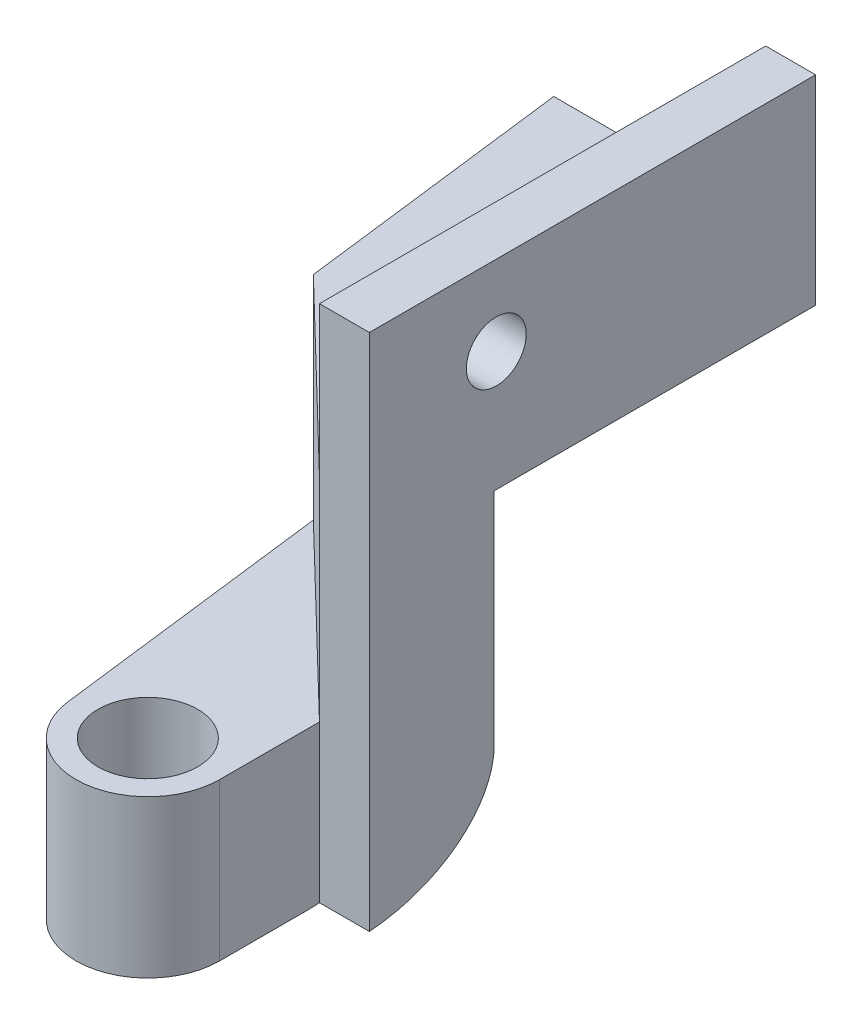
ISO-10303-21;
HEADER;
FILE_DESCRIPTION(('STEP AP214'),'2;1');
FILE_NAME('part.step','',(''),(''),'','','');
FILE_SCHEMA(('AUTOMOTIVE_DESIGN { 1 0 10303 214 1 1 1 1 }'));
ENDSEC;
DATA;
#1=APPLICATION_CONTEXT('core data for automotive mechanical design processes');
#2=APPLICATION_PROTOCOL_DEFINITION('international standard','automotive_design',2000,#1);
#3=PRODUCT_CONTEXT('',#1,'mechanical');
#4=PRODUCT('Part','Part','',(#3));
#5=PRODUCT_RELATED_PRODUCT_CATEGORY('part','',(#4));
#6=PRODUCT_DEFINITION_FORMATION('','',#4);
#7=PRODUCT_DEFINITION_CONTEXT('part definition',#1,'design');
#8=PRODUCT_DEFINITION('design','',#6,#7);
#9=PRODUCT_DEFINITION_SHAPE('','',#8);
#10=(LENGTH_UNIT() NAMED_UNIT(*) SI_UNIT(.MILLI.,.METRE.));
#11=(NAMED_UNIT(*) PLANE_ANGLE_UNIT() SI_UNIT($,.RADIAN.));
#12=(NAMED_UNIT(*) SI_UNIT($,.STERADIAN.) SOLID_ANGLE_UNIT());
#13=UNCERTAINTY_MEASURE_WITH_UNIT(LENGTH_MEASURE(1.E-05),#10,'distance_accuracy_value','');
#14=(GEOMETRIC_REPRESENTATION_CONTEXT(3) GLOBAL_UNCERTAINTY_ASSIGNED_CONTEXT((#13)) GLOBAL_UNIT_ASSIGNED_CONTEXT((#10,
#11,#12)) REPRESENTATION_CONTEXT('',''));
#15=CARTESIAN_POINT('',(0.,0.,0.));
#16=DIRECTION('',(0.,0.,1.));
#17=DIRECTION('',(1.,0.,0.));
#18=AXIS2_PLACEMENT_3D('',#15,#16,#17);
#19=CARTESIAN_POINT('',(4.23565797348321,-2.5,-4.38615223039065));
#20=DIRECTION('',(-0.694658370458993,0.,0.719339800338655));
#21=DIRECTION('',(0.719339800338655,0.,0.694658370458993));
#22=AXIS2_PLACEMENT_3D('',#19,#20,#21);
#23=PLANE('',#22);
#24=DIRECTION('',(0.,1.,0.));
#25=VECTOR('',#24,1.);
#26=CARTESIAN_POINT('',(-5.31499406887196,-2.5,-13.6091096997812));
#27=LINE('',#26,#25);
#28=CARTESIAN_POINT('',(-5.31499406887196,-10.65,-13.6091096997812));
#29=VERTEX_POINT('',#28);
#30=CARTESIAN_POINT('',(-5.31499406887196,0.,-13.6091096997812));
#31=VERTEX_POINT('',#30);
#32=EDGE_CURVE('E212',#29,#31,#27,.T.);
#33=ORIENTED_EDGE('',*,*,#32,.F.);
#34=DIRECTION('',(0.719339800338655,0.,0.694658370458993));
#35=VECTOR('',#34,1.);
#36=CARTESIAN_POINT('',(4.23565797348321,-10.65,-4.38615223039065));
#37=LINE('',#36,#35);
#38=CARTESIAN_POINT('',(3.6,-10.65,-5.));
#39=VERTEX_POINT('',#38);
#40=EDGE_CURVE('E180',#29,#39,#37,.T.);
#41=ORIENTED_EDGE('',*,*,#40,.T.);
#42=DIRECTION('',(0.,1.,0.));
#43=VECTOR('',#42,1.);
#44=CARTESIAN_POINT('',(3.6,-2.5,-5.));
#45=LINE('',#44,#43);
#46=CARTESIAN_POINT('',(3.6,0.,-5.));
#47=VERTEX_POINT('',#46);
#48=EDGE_CURVE('E229',#39,#47,#45,.T.);
#49=ORIENTED_EDGE('',*,*,#48,.T.);
#50=DIRECTION('',(0.719339800338655,0.,0.694658370458993));
#51=VECTOR('',#50,1.);
#52=CARTESIAN_POINT('',(4.23565797348321,0.,-4.38615223039065));
#53=LINE('',#52,#51);
#54=EDGE_CURVE('E219',#31,#47,#53,.T.);
#55=ORIENTED_EDGE('',*,*,#54,.F.);
#56=EDGE_LOOP('',(#33,#41,#49,#55));
#57=FACE_BOUND('',#56,.T.);
#58=ADVANCED_FACE('F41',(#57),#23,.T.);
#59=CARTESIAN_POINT('',(0.,-2.5,0.));
#60=DIRECTION('',(0.,1.,0.));
#61=DIRECTION('',(0.,0.,1.));
#62=AXIS2_PLACEMENT_3D('',#59,#60,#61);
#63=PLANE('',#62);
#64=CARTESIAN_POINT('',(-0.399999999999994,-2.5,-21.36));
#65=DIRECTION('',(0.,1.,0.));
#66=DIRECTION('',(0.,0.,1.));
#67=AXIS2_PLACEMENT_3D('',#64,#65,#66);
#68=CIRCLE('',#67,1.5);
#69=CARTESIAN_POINT('',(-0.399999999999994,-2.5,-19.86));
#70=VERTEX_POINT('',#69);
#71=EDGE_CURVE('E204',#70,#70,#68,.T.);
#72=ORIENTED_EDGE('',*,*,#71,.T.);
#73=EDGE_LOOP('',(#72));
#74=FACE_BOUND('',#73,.T.);
#75=DIRECTION('',(0.719339800338655,0.,0.694658370458993));
#76=VECTOR('',#75,1.);
#77=CARTESIAN_POINT('',(7.36162064054869,-2.5,-7.6231813319146));
#78=LINE('',#77,#76);
#79=CARTESIAN_POINT('',(-6.19616788061343,-2.5,-20.7157855180089));
#80=VERTEX_POINT('',#79);
#81=CARTESIAN_POINT('',(3.6,-2.50000000000002,-11.255736159575));
#82=VERTEX_POINT('',#81);
#83=EDGE_CURVE('E228',#80,#82,#78,.T.);
#84=ORIENTED_EDGE('',*,*,#83,.F.);
#85=DIRECTION('',(0.123050117455701,0.,0.992400457776063));
#86=VECTOR('',#85,1.);
#87=CARTESIAN_POINT('',(-3.57264164799382,-2.5,0.442980422840522));
#88=LINE('',#87,#86);
#89=CARTESIAN_POINT('',(-7.02000000000001,-2.5,-27.36));
#90=VERTEX_POINT('',#89);
#91=EDGE_CURVE('E210',#90,#80,#88,.T.);
#92=ORIENTED_EDGE('',*,*,#91,.F.);
#93=DIRECTION('',(-1.,0.,0.));
#94=VECTOR('',#93,1.);
#95=CARTESIAN_POINT('',(0.,-2.5,-27.36));
#96=LINE('',#95,#94);
#97=CARTESIAN_POINT('',(6.10000000000001,-2.5,-27.36));
#98=VERTEX_POINT('',#97);
#99=EDGE_CURVE('E211',#98,#90,#96,.T.);
#100=ORIENTED_EDGE('',*,*,#99,.F.);
#101=DIRECTION('',(0.,0.,-1.));
#102=VECTOR('',#101,1.);
#103=CARTESIAN_POINT('',(6.09999999999999,-2.5,0.));
#104=LINE('',#103,#102);
#105=CARTESIAN_POINT('',(6.1,-2.5,-11.255736159575));
#106=VERTEX_POINT('',#105);
#107=EDGE_CURVE('E268',#106,#98,#104,.T.);
#108=ORIENTED_EDGE('',*,*,#107,.F.);
#109=DIRECTION('',(-1.,0.,0.));
#110=VECTOR('',#109,1.);
#111=CARTESIAN_POINT('',(6.1,-2.5,-11.255736159575));
#112=LINE('',#111,#110);
#113=EDGE_CURVE('E166',#106,#82,#112,.T.);
#114=ORIENTED_EDGE('',*,*,#113,.T.);
#115=EDGE_LOOP('',(#84,#92,#100,#108,#114));
#116=FACE_BOUND('',#115,.T.);
#117=ADVANCED_FACE('F264',(#74,#116),#63,.F.);
#118=CARTESIAN_POINT('',(-3.57264164799382,-2.5,0.442980422840522));
#119=DIRECTION('',(-0.992400457776062,0.,0.123050117455701));
#120=DIRECTION('',(0.123050117455701,0.,0.992400457776062));
#121=AXIS2_PLACEMENT_3D('',#118,#119,#120);
#122=PLANE('',#121);
#123=DIRECTION('',(0.,1.,0.));
#124=VECTOR('',#123,1.);
#125=CARTESIAN_POINT('',(-6.19616788061343,-37.0389313836739,-20.7157855180089));
#126=LINE('',#125,#124);
#127=CARTESIAN_POINT('',(-6.19616788061343,-13.52,-20.7157855180089));
#128=VERTEX_POINT('',#127);
#129=EDGE_CURVE('E192',#128,#80,#126,.T.);
#130=ORIENTED_EDGE('',*,*,#129,.F.);
#131=CARTESIAN_POINT('',(-5.21708586756735,-13.52,-12.8194790533115));
#132=DIRECTION('',(-0.992400457776062,0.,0.123050117455701));
#133=DIRECTION('',(-0.123050117455701,0.,-0.992400457776063));
#134=AXIS2_PLACEMENT_3D('',#131,#132,#133);
#135=ELLIPSE('',#134,7.95677430700992,5.);
#136=CARTESIAN_POINT('',(-5.21708586756735,-18.52,-12.8194790533115));
#137=VERTEX_POINT('',#136);
#138=EDGE_CURVE('E66',#128,#137,#135,.T.);
#139=ORIENTED_EDGE('',*,*,#138,.T.);
#140=DIRECTION('',(-0.123050117455701,0.,-0.992400457776062));
#141=VECTOR('',#140,1.);
#142=CARTESIAN_POINT('',(-3.57264164799382,-18.52,0.442980422840522));
#143=LINE('',#142,#141);
#144=CARTESIAN_POINT('',(-3.57264164799382,-18.52,0.442980422840522));
#145=VERTEX_POINT('',#144);
#146=EDGE_CURVE('E197',#145,#137,#143,.T.);
#147=ORIENTED_EDGE('',*,*,#146,.F.);
#148=DIRECTION('',(0.,1.,0.));
#149=VECTOR('',#148,1.);
#150=CARTESIAN_POINT('',(-3.57264164799382,-18.52,0.442980422840522));
#151=LINE('',#150,#149);
#152=CARTESIAN_POINT('',(-3.57264164799382,-10.65,0.442980422840522));
#153=VERTEX_POINT('',#152);
#154=EDGE_CURVE('E178',#145,#153,#151,.T.);
#155=ORIENTED_EDGE('',*,*,#154,.T.);
#156=DIRECTION('',(0.123050117455701,0.,0.992400457776063));
#157=VECTOR('',#156,1.);
#158=CARTESIAN_POINT('',(-3.57264164799382,-10.65,0.442980422840522));
#159=LINE('',#158,#157);
#160=EDGE_CURVE('E170',#29,#153,#159,.T.);
#161=ORIENTED_EDGE('',*,*,#160,.F.);
#162=ORIENTED_EDGE('',*,*,#32,.T.);
#163=DIRECTION('',(0.123050117455701,0.,0.992400457776063));
#164=VECTOR('',#163,1.);
#165=CARTESIAN_POINT('',(-3.57264164799382,0.,0.442980422840522));
#166=LINE('',#165,#164);
#167=CARTESIAN_POINT('',(-7.02000000000001,0.,-27.36));
#168=VERTEX_POINT('',#167);
#169=EDGE_CURVE('E220',#168,#31,#166,.T.);
#170=ORIENTED_EDGE('',*,*,#169,.F.);
#171=DIRECTION('',(0.,1.,0.));
#172=VECTOR('',#171,1.);
#173=CARTESIAN_POINT('',(-7.02000000000001,-2.5,-27.36));
#174=LINE('',#173,#172);
#175=EDGE_CURVE('E230',#90,#168,#174,.T.);
#176=ORIENTED_EDGE('',*,*,#175,.F.);
#177=ORIENTED_EDGE('',*,*,#91,.T.);
#178=EDGE_LOOP('',(#130,#139,#147,#155,#161,#162,#170,#176,#177));
#179=FACE_BOUND('',#178,.T.);
#180=ADVANCED_FACE('F272',(#179),#122,.T.);
#181=CARTESIAN_POINT('',(0.,-2.5,-27.36));
#182=DIRECTION('',(0.,0.,-1.));
#183=DIRECTION('',(-1.,0.,0.));
#184=AXIS2_PLACEMENT_3D('',#181,#182,#183);
#185=PLANE('',#184);
#186=DIRECTION('',(-1.,0.,0.));
#187=VECTOR('',#186,1.);
#188=CARTESIAN_POINT('',(0.,0.,-27.36));
#189=LINE('',#188,#187);
#190=CARTESIAN_POINT('',(3.60000000000001,0.,-27.36));
#191=VERTEX_POINT('',#190);
#192=EDGE_CURVE('E208',#191,#168,#189,.T.);
#193=ORIENTED_EDGE('',*,*,#192,.F.);
#194=DIRECTION('',(0.,1.,0.));
#195=VECTOR('',#194,1.);
#196=CARTESIAN_POINT('',(3.60000000000001,0.,-27.36));
#197=LINE('',#196,#195);
#198=CARTESIAN_POINT('',(3.60000000000001,7.5,-27.36));
#199=VERTEX_POINT('',#198);
#200=EDGE_CURVE('E246',#191,#199,#197,.T.);
#201=ORIENTED_EDGE('',*,*,#200,.T.);
#202=DIRECTION('',(-1.,0.,0.));
#203=VECTOR('',#202,1.);
#204=CARTESIAN_POINT('',(6.10000000000001,7.5,-27.36));
#205=LINE('',#204,#203);
#206=CARTESIAN_POINT('',(6.10000000000001,7.5,-27.36));
#207=VERTEX_POINT('',#206);
#208=EDGE_CURVE('E260',#207,#199,#205,.T.);
#209=ORIENTED_EDGE('',*,*,#208,.F.);
#210=DIRECTION('',(0.,1.,0.));
#211=VECTOR('',#210,1.);
#212=CARTESIAN_POINT('',(6.10000000000001,0.,-27.36));
#213=LINE('',#212,#211);
#214=EDGE_CURVE('E278',#98,#207,#213,.T.);
#215=ORIENTED_EDGE('',*,*,#214,.F.);
#216=ORIENTED_EDGE('',*,*,#99,.T.);
#217=ORIENTED_EDGE('',*,*,#175,.T.);
#218=EDGE_LOOP('',(#193,#201,#209,#215,#216,#217));
#219=FACE_BOUND('',#218,.T.);
#220=ADVANCED_FACE('F279',(#219),#185,.T.);
#221=CARTESIAN_POINT('',(3.59999999999999,-2.5,0.));
#222=DIRECTION('',(1.,0.,0.));
#223=DIRECTION('',(0.,0.,-1.));
#224=AXIS2_PLACEMENT_3D('',#221,#222,#223);
#225=PLANE('',#224);
#226=DIRECTION('',(0.,-1.,0.));
#227=VECTOR('',#226,1.);
#228=CARTESIAN_POINT('',(3.59999999999999,0.,-5.));
#229=LINE('',#228,#227);
#230=CARTESIAN_POINT('',(3.59999999999999,-18.4949371855331,-5.));
#231=VERTEX_POINT('',#230);
#232=EDGE_CURVE('E11',#39,#231,#229,.T.);
#233=ORIENTED_EDGE('',*,*,#232,.F.);
#234=DIRECTION('',(0.,0.,-1.));
#235=VECTOR('',#234,1.);
#236=CARTESIAN_POINT('',(3.59999999999999,-10.65,0.));
#237=LINE('',#236,#235);
#238=CARTESIAN_POINT('',(3.59999999999999,-10.65,0.));
#239=VERTEX_POINT('',#238);
#240=EDGE_CURVE('E186',#239,#39,#237,.T.);
#241=ORIENTED_EDGE('',*,*,#240,.F.);
#242=DIRECTION('',(0.,1.,0.));
#243=VECTOR('',#242,1.);
#244=CARTESIAN_POINT('',(3.59999999999999,-18.52,0.));
#245=LINE('',#244,#243);
#246=CARTESIAN_POINT('',(3.59999999999999,-18.52,0.));
#247=VERTEX_POINT('',#246);
#248=EDGE_CURVE('E191',#247,#239,#245,.T.);
#249=ORIENTED_EDGE('',*,*,#248,.F.);
#250=DIRECTION('',(0.,0.,1.));
#251=VECTOR('',#250,1.);
#252=CARTESIAN_POINT('',(3.59999999999999,-18.52,0.));
#253=LINE('',#252,#251);
#254=CARTESIAN_POINT('',(3.59999999999999,-18.52,-4.30491820449167));
#255=VERTEX_POINT('',#254);
#256=EDGE_CURVE('E194',#255,#247,#253,.T.);
#257=ORIENTED_EDGE('',*,*,#256,.F.);
#258=CARTESIAN_POINT('',(3.59999999999999,-13.52,-4.30491820449167));
#259=DIRECTION('',(1.,0.,0.));
#260=DIRECTION('',(0.,0.,-1.));
#261=AXIS2_PLACEMENT_3D('',#258,#259,#260);
#262=ELLIPSE('',#261,6.95081795508335,5.);
#263=EDGE_CURVE('E44',#255,#231,#262,.T.);
#264=ORIENTED_EDGE('',*,*,#263,.T.);
#265=EDGE_LOOP('',(#233,#241,#249,#257,#264));
#266=FACE_BOUND('',#265,.T.);
#267=ADVANCED_FACE('F238',(#266),#225,.T.);
#268=CARTESIAN_POINT('',(-0.399999999999994,-2.5,-21.36));
#269=DIRECTION('',(0.,1.,0.));
#270=DIRECTION('',(0.,0.,1.));
#271=AXIS2_PLACEMENT_3D('',#268,#269,#270);
#272=CYLINDRICAL_SURFACE('',#271,1.5);
#273=ORIENTED_EDGE('',*,*,#71,.F.);
#274=EDGE_LOOP('',(#273));
#275=FACE_BOUND('',#274,.T.);
#276=CARTESIAN_POINT('',(-0.399999999999994,0.,-21.36));
#277=DIRECTION('',(0.,1.,0.));
#278=DIRECTION('',(0.,0.,1.));
#279=AXIS2_PLACEMENT_3D('',#276,#277,#278);
#280=CIRCLE('',#279,1.5);
#281=CARTESIAN_POINT('',(-0.399999999999994,0.,-19.86));
#282=VERTEX_POINT('',#281);
#283=EDGE_CURVE('E201',#282,#282,#280,.T.);
#284=ORIENTED_EDGE('',*,*,#283,.T.);
#285=EDGE_LOOP('',(#284));
#286=FACE_BOUND('',#285,.T.);
#287=ADVANCED_FACE('F312',(#275,#286),#272,.F.);
#288=CARTESIAN_POINT('',(0.,0.,0.));
#289=DIRECTION('',(0.,1.,0.));
#290=DIRECTION('',(0.,0.,1.));
#291=AXIS2_PLACEMENT_3D('',#288,#289,#290);
#292=PLANE('',#291);
#293=DIRECTION('',(0.,0.,-1.));
#294=VECTOR('',#293,1.);
#295=CARTESIAN_POINT('',(3.59999999999999,0.,0.));
#296=LINE('',#295,#294);
#297=EDGE_CURVE('E224',#47,#191,#296,.T.);
#298=ORIENTED_EDGE('',*,*,#297,.T.);
#299=ORIENTED_EDGE('',*,*,#192,.T.);
#300=ORIENTED_EDGE('',*,*,#169,.T.);
#301=ORIENTED_EDGE('',*,*,#54,.T.);
#302=EDGE_LOOP('',(#298,#299,#300,#301));
#303=FACE_BOUND('',#302,.T.);
#304=ORIENTED_EDGE('',*,*,#283,.F.);
#305=EDGE_LOOP('',(#304));
#306=FACE_BOUND('',#305,.T.);
#307=ADVANCED_FACE('F320',(#303,#306),#292,.T.);
#308=CARTESIAN_POINT('',(7.36162064054869,-37.0389313836739,-7.6231813319146));
#309=DIRECTION('',(-0.694658370458993,0.,0.719339800338655));
#310=DIRECTION('',(0.719339800338655,0.,0.694658370458993));
#311=AXIS2_PLACEMENT_3D('',#308,#309,#310);
#312=PLANE('',#311);
#313=DIRECTION('',(0.,1.,0.));
#314=VECTOR('',#313,1.);
#315=CARTESIAN_POINT('',(3.6,-37.0389313836739,-11.255736159575));
#316=LINE('',#315,#314);
#317=CARTESIAN_POINT('',(3.6,-13.52,-11.255736159575));
#318=VERTEX_POINT('',#317);
#319=EDGE_CURVE('E196',#318,#82,#316,.T.);
#320=ORIENTED_EDGE('',*,*,#319,.F.);
#321=DIRECTION('',(-0.719339800338655,0.,-0.694658370458993));
#322=VECTOR('',#321,1.);
#323=CARTESIAN_POINT('',(7.36162064054869,-13.52,-7.6231813319146));
#324=LINE('',#323,#322);
#325=EDGE_CURVE('E233',#318,#128,#324,.T.);
#326=ORIENTED_EDGE('',*,*,#325,.T.);
#327=ORIENTED_EDGE('',*,*,#129,.T.);
#328=ORIENTED_EDGE('',*,*,#83,.T.);
#329=EDGE_LOOP('',(#320,#326,#327,#328));
#330=FACE_BOUND('',#329,.T.);
#331=ADVANCED_FACE('F275',(#330),#312,.F.);
#332=CARTESIAN_POINT('',(0.,-18.52,0.));
#333=DIRECTION('',(0.,1.,0.));
#334=DIRECTION('',(0.,0.,1.));
#335=AXIS2_PLACEMENT_3D('',#332,#333,#334);
#336=PLANE('',#335);
#337=ORIENTED_EDGE('',*,*,#146,.T.);
#338=DIRECTION('',(-0.719339800338655,0.,-0.694658370458993));
#339=VECTOR('',#338,1.);
#340=CARTESIAN_POINT('',(3.88832878825372,-18.52,-4.02648233022133));
#341=LINE('',#340,#339);
#342=EDGE_CURVE('E59',#137,#255,#341,.F.);
#343=ORIENTED_EDGE('',*,*,#342,.T.);
#344=ORIENTED_EDGE('',*,*,#256,.T.);
#345=CARTESIAN_POINT('',(0.,-18.52,0.));
#346=DIRECTION('',(0.,1.,0.));
#347=DIRECTION('',(0.,0.,1.));
#348=AXIS2_PLACEMENT_3D('',#345,#346,#347);
#349=CIRCLE('',#348,3.59999999999999);
#350=EDGE_CURVE('E176',#145,#247,#349,.T.);
#351=ORIENTED_EDGE('',*,*,#350,.F.);
#352=EDGE_LOOP('',(#337,#343,#344,#351));
#353=FACE_BOUND('',#352,.T.);
#354=CARTESIAN_POINT('',(0.,-18.52,0.));
#355=DIRECTION('',(0.,1.,0.));
#356=DIRECTION('',(0.,0.,1.));
#357=AXIS2_PLACEMENT_3D('',#354,#355,#356);
#358=CIRCLE('',#357,2.5);
#359=CARTESIAN_POINT('',(0.,-18.52,2.5));
#360=VERTEX_POINT('',#359);
#361=EDGE_CURVE('E172',#360,#360,#358,.T.);
#362=ORIENTED_EDGE('',*,*,#361,.T.);
#363=EDGE_LOOP('',(#362));
#364=FACE_BOUND('',#363,.T.);
#365=ADVANCED_FACE('F337',(#353,#364),#336,.F.);
#366=CARTESIAN_POINT('',(0.,-18.52,0.));
#367=DIRECTION('',(0.,1.,0.));
#368=DIRECTION('',(0.,0.,1.));
#369=AXIS2_PLACEMENT_3D('',#366,#367,#368);
#370=CYLINDRICAL_SURFACE('',#369,2.5);
#371=ORIENTED_EDGE('',*,*,#361,.F.);
#372=EDGE_LOOP('',(#371));
#373=FACE_BOUND('',#372,.T.);
#374=CARTESIAN_POINT('',(0.,-10.65,0.));
#375=DIRECTION('',(0.,1.,0.));
#376=DIRECTION('',(0.,0.,1.));
#377=AXIS2_PLACEMENT_3D('',#374,#375,#376);
#378=CIRCLE('',#377,2.5);
#379=CARTESIAN_POINT('',(0.,-10.65,2.5));
#380=VERTEX_POINT('',#379);
#381=EDGE_CURVE('E163',#380,#380,#378,.T.);
#382=ORIENTED_EDGE('',*,*,#381,.T.);
#383=EDGE_LOOP('',(#382));
#384=FACE_BOUND('',#383,.T.);
#385=ADVANCED_FACE('F339',(#373,#384),#370,.F.);
#386=CARTESIAN_POINT('',(0.,-18.52,0.));
#387=DIRECTION('',(0.,1.,0.));
#388=DIRECTION('',(0.,0.,1.));
#389=AXIS2_PLACEMENT_3D('',#386,#387,#388);
#390=CYLINDRICAL_SURFACE('',#389,3.59999999999999);
#391=CARTESIAN_POINT('',(0.,-10.65,0.));
#392=DIRECTION('',(0.,1.,0.));
#393=DIRECTION('',(0.,0.,1.));
#394=AXIS2_PLACEMENT_3D('',#391,#392,#393);
#395=CIRCLE('',#394,3.59999999999999);
#396=EDGE_CURVE('E181',#153,#239,#395,.T.);
#397=ORIENTED_EDGE('',*,*,#396,.F.);
#398=ORIENTED_EDGE('',*,*,#154,.F.);
#399=ORIENTED_EDGE('',*,*,#350,.T.);
#400=ORIENTED_EDGE('',*,*,#248,.T.);
#401=EDGE_LOOP('',(#397,#398,#399,#400));
#402=FACE_BOUND('',#401,.T.);
#403=ADVANCED_FACE('F345',(#402),#390,.T.);
#404=CARTESIAN_POINT('',(0.,-10.65,0.));
#405=DIRECTION('',(0.,1.,0.));
#406=DIRECTION('',(0.,0.,1.));
#407=AXIS2_PLACEMENT_3D('',#404,#405,#406);
#408=PLANE('',#407);
#409=ORIENTED_EDGE('',*,*,#381,.F.);
#410=EDGE_LOOP('',(#409));
#411=FACE_BOUND('',#410,.T.);
#412=ORIENTED_EDGE('',*,*,#160,.T.);
#413=ORIENTED_EDGE('',*,*,#396,.T.);
#414=ORIENTED_EDGE('',*,*,#240,.T.);
#415=ORIENTED_EDGE('',*,*,#40,.F.);
#416=EDGE_LOOP('',(#412,#413,#414,#415));
#417=FACE_BOUND('',#416,.T.);
#418=ADVANCED_FACE('F347',(#411,#417),#408,.T.);
#419=CARTESIAN_POINT('',(3.88832878825372,-13.52,-4.02648233022133));
#420=DIRECTION('',(-0.719339800338655,0.,-0.694658370458993));
#421=DIRECTION('',(-0.694658370458993,0.,0.719339800338655));
#422=AXIS2_PLACEMENT_3D('',#419,#420,#421);
#423=CYLINDRICAL_SURFACE('',#422,5.);
#424=ORIENTED_EDGE('',*,*,#263,.F.);
#425=ORIENTED_EDGE('',*,*,#342,.F.);
#426=ORIENTED_EDGE('',*,*,#138,.F.);
#427=ORIENTED_EDGE('',*,*,#325,.F.);
#428=CARTESIAN_POINT('',(3.59999999999999,-13.52,-4.30491820449167));
#429=DIRECTION('',(1.,0.,0.));
#430=DIRECTION('',(0.,0.,-1.));
#431=AXIS2_PLACEMENT_3D('',#428,#429,#430);
#432=ELLIPSE('',#431,6.95081795508335,5.);
#433=EDGE_CURVE('E244',#231,#318,#432,.T.);
#434=ORIENTED_EDGE('',*,*,#433,.F.);
#435=EDGE_LOOP('',(#424,#425,#426,#427,#434));
#436=FACE_BOUND('',#435,.T.);
#437=ADVANCED_FACE('F43',(#436),#423,.T.);
#438=CARTESIAN_POINT('',(6.09999999999999,0.,-4.99999999999999));
#439=DIRECTION('',(0.,0.,-1.));
#440=DIRECTION('',(-1.,0.,0.));
#441=AXIS2_PLACEMENT_3D('',#438,#439,#440);
#442=PLANE('',#441);
#443=CARTESIAN_POINT('',(3.59999999999999,7.5,-4.99999999999999));
#444=VERTEX_POINT('',#443);
#445=EDGE_CURVE('E51',#444,#47,#229,.T.);
#446=ORIENTED_EDGE('',*,*,#445,.T.);
#447=ORIENTED_EDGE('',*,*,#48,.F.);
#448=ORIENTED_EDGE('',*,*,#232,.T.);
#449=DIRECTION('',(-1.,0.,0.));
#450=VECTOR('',#449,1.);
#451=CARTESIAN_POINT('',(6.09999999999999,-18.4949371855331,-4.99999999999999));
#452=LINE('',#451,#450);
#453=CARTESIAN_POINT('',(6.09999999999999,-18.4949371855331,-4.99999999999999));
#454=VERTEX_POINT('',#453);
#455=EDGE_CURVE('E141',#454,#231,#452,.T.);
#456=ORIENTED_EDGE('',*,*,#455,.F.);
#457=DIRECTION('',(0.,-1.,0.));
#458=VECTOR('',#457,1.);
#459=CARTESIAN_POINT('',(6.09999999999999,0.,-4.99999999999999));
#460=LINE('',#459,#458);
#461=CARTESIAN_POINT('',(6.09999999999999,7.5,-4.99999999999999));
#462=VERTEX_POINT('',#461);
#463=EDGE_CURVE('E149',#462,#454,#460,.T.);
#464=ORIENTED_EDGE('',*,*,#463,.F.);
#465=DIRECTION('',(-1.,0.,0.));
#466=VECTOR('',#465,1.);
#467=CARTESIAN_POINT('',(6.09999999999999,7.5,-4.99999999999999));
#468=LINE('',#467,#466);
#469=EDGE_CURVE('E254',#462,#444,#468,.T.);
#470=ORIENTED_EDGE('',*,*,#469,.T.);
#471=EDGE_LOOP('',(#446,#447,#448,#456,#464,#470));
#472=FACE_BOUND('',#471,.T.);
#473=ADVANCED_FACE('F165',(#472),#442,.F.);
#474=CARTESIAN_POINT('',(6.09999999999999,-13.52,-4.30491820449167));
#475=DIRECTION('',(1.,0.,0.));
#476=DIRECTION('',(0.,0.,-1.));
#477=AXIS2_PLACEMENT_3D('',#474,#475,#476);
#478=ELLIPSE('',#477,6.95081795508335,5.);
#479=DIRECTION('',(-1.,0.,0.));
#480=VECTOR('',#479,1.);
#481=SURFACE_OF_LINEAR_EXTRUSION('',#478,#480);
#482=ORIENTED_EDGE('',*,*,#433,.T.);
#483=DIRECTION('',(-1.,0.,0.));
#484=VECTOR('',#483,1.);
#485=CARTESIAN_POINT('',(6.1,-13.52,-11.255736159575));
#486=LINE('',#485,#484);
#487=CARTESIAN_POINT('',(6.1,-13.52,-11.255736159575));
#488=VERTEX_POINT('',#487);
#489=EDGE_CURVE('E144',#488,#318,#486,.T.);
#490=ORIENTED_EDGE('',*,*,#489,.F.);
#491=EDGE_CURVE('E137',#454,#488,#478,.T.);
#492=ORIENTED_EDGE('',*,*,#491,.F.);
#493=ORIENTED_EDGE('',*,*,#455,.T.);
#494=EDGE_LOOP('',(#482,#490,#492,#493));
#495=FACE_BOUND('',#494,.T.);
#496=ADVANCED_FACE('F143',(#495),#481,.F.);
#497=CARTESIAN_POINT('',(6.1,0.,-11.255736159575));
#498=DIRECTION('',(0.,0.,1.));
#499=DIRECTION('',(1.,0.,0.));
#500=AXIS2_PLACEMENT_3D('',#497,#498,#499);
#501=PLANE('',#500);
#502=ORIENTED_EDGE('',*,*,#319,.T.);
#503=ORIENTED_EDGE('',*,*,#113,.F.);
#504=DIRECTION('',(0.,1.,0.));
#505=VECTOR('',#504,1.);
#506=CARTESIAN_POINT('',(6.1,0.,-11.255736159575));
#507=LINE('',#506,#505);
#508=EDGE_CURVE('E146',#488,#106,#507,.T.);
#509=ORIENTED_EDGE('',*,*,#508,.F.);
#510=ORIENTED_EDGE('',*,*,#489,.T.);
#511=EDGE_LOOP('',(#502,#503,#509,#510));
#512=FACE_BOUND('',#511,.T.);
#513=ADVANCED_FACE('F269',(#512),#501,.F.);
#514=CARTESIAN_POINT('',(6.09999999999999,7.5,0.));
#515=DIRECTION('',(0.,-1.,0.));
#516=DIRECTION('',(0.,0.,-1.));
#517=AXIS2_PLACEMENT_3D('',#514,#515,#516);
#518=PLANE('',#517);
#519=DIRECTION('',(0.,0.,1.));
#520=VECTOR('',#519,1.);
#521=CARTESIAN_POINT('',(3.59999999999999,7.5,0.));
#522=LINE('',#521,#520);
#523=EDGE_CURVE('E247',#199,#444,#522,.T.);
#524=ORIENTED_EDGE('',*,*,#523,.T.);
#525=ORIENTED_EDGE('',*,*,#469,.F.);
#526=DIRECTION('',(0.,0.,1.));
#527=VECTOR('',#526,1.);
#528=CARTESIAN_POINT('',(6.09999999999999,7.5,0.));
#529=LINE('',#528,#527);
#530=EDGE_CURVE('E154',#207,#462,#529,.T.);
#531=ORIENTED_EDGE('',*,*,#530,.F.);
#532=ORIENTED_EDGE('',*,*,#208,.T.);
#533=EDGE_LOOP('',(#524,#525,#531,#532));
#534=FACE_BOUND('',#533,.T.);
#535=ADVANCED_FACE('F298',(#534),#518,.F.);
#536=CARTESIAN_POINT('',(6.1,3.5,-11.36));
#537=DIRECTION('',(-1.,0.,0.));
#538=DIRECTION('',(0.,0.,1.));
#539=AXIS2_PLACEMENT_3D('',#536,#537,#538);
#540=CYLINDRICAL_SURFACE('',#539,1.5);
#541=CARTESIAN_POINT('',(6.1,3.5,-11.36));
#542=DIRECTION('',(1.,0.,0.));
#543=DIRECTION('',(0.,0.,-1.));
#544=AXIS2_PLACEMENT_3D('',#541,#542,#543);
#545=CIRCLE('',#544,1.5);
#546=CARTESIAN_POINT('',(6.1,3.5,-12.86));
#547=VERTEX_POINT('',#546);
#548=EDGE_CURVE('E256',#547,#547,#545,.T.);
#549=ORIENTED_EDGE('',*,*,#548,.T.);
#550=EDGE_LOOP('',(#549));
#551=FACE_BOUND('',#550,.T.);
#552=CARTESIAN_POINT('',(3.6,3.5,-11.36));
#553=DIRECTION('',(1.,0.,0.));
#554=DIRECTION('',(0.,0.,-1.));
#555=AXIS2_PLACEMENT_3D('',#552,#553,#554);
#556=CIRCLE('',#555,1.5);
#557=CARTESIAN_POINT('',(3.6,3.5,-12.86));
#558=VERTEX_POINT('',#557);
#559=EDGE_CURVE('E157',#558,#558,#556,.T.);
#560=ORIENTED_EDGE('',*,*,#559,.F.);
#561=EDGE_LOOP('',(#560));
#562=FACE_BOUND('',#561,.T.);
#563=ADVANCED_FACE('F287',(#551,#562),#540,.F.);
#564=CARTESIAN_POINT('',(6.09999999999999,0.,0.));
#565=DIRECTION('',(1.,0.,0.));
#566=DIRECTION('',(0.,0.,-1.));
#567=AXIS2_PLACEMENT_3D('',#564,#565,#566);
#568=PLANE('',#567);
#569=ORIENTED_EDGE('',*,*,#463,.T.);
#570=ORIENTED_EDGE('',*,*,#491,.T.);
#571=ORIENTED_EDGE('',*,*,#508,.T.);
#572=ORIENTED_EDGE('',*,*,#107,.T.);
#573=ORIENTED_EDGE('',*,*,#214,.T.);
#574=ORIENTED_EDGE('',*,*,#530,.T.);
#575=EDGE_LOOP('',(#569,#570,#571,#572,#573,#574));
#576=FACE_BOUND('',#575,.T.);
#577=ORIENTED_EDGE('',*,*,#548,.F.);
#578=EDGE_LOOP('',(#577));
#579=FACE_BOUND('',#578,.T.);
#580=ADVANCED_FACE('F155',(#576,#579),#568,.T.);
#581=CARTESIAN_POINT('',(3.59999999999999,0.,0.));
#582=DIRECTION('',(1.,0.,0.));
#583=DIRECTION('',(0.,0.,-1.));
#584=AXIS2_PLACEMENT_3D('',#581,#582,#583);
#585=PLANE('',#584);
#586=ORIENTED_EDGE('',*,*,#297,.F.);
#587=ORIENTED_EDGE('',*,*,#445,.F.);
#588=ORIENTED_EDGE('',*,*,#523,.F.);
#589=ORIENTED_EDGE('',*,*,#200,.F.);
#590=EDGE_LOOP('',(#586,#587,#588,#589));
#591=FACE_BOUND('',#590,.T.);
#592=ORIENTED_EDGE('',*,*,#559,.T.);
#593=EDGE_LOOP('',(#592));
#594=FACE_BOUND('',#593,.T.);
#595=ADVANCED_FACE('F292',(#591,#594),#585,.F.);
#596=CLOSED_SHELL('',(#58,#117,#180,#220,#267,#287,#307,#331,#365,#385,#403,#418,#437,#473,#496,
#513,#535,#563,#580,#595));
#597=MANIFOLD_SOLID_BREP('B2',#596);
#598=ADVANCED_BREP_SHAPE_REPRESENTATION('',(#18,#597),#14);
#599=SHAPE_DEFINITION_REPRESENTATION(#9,#598);
ENDSEC;
END-ISO-10303-21;
